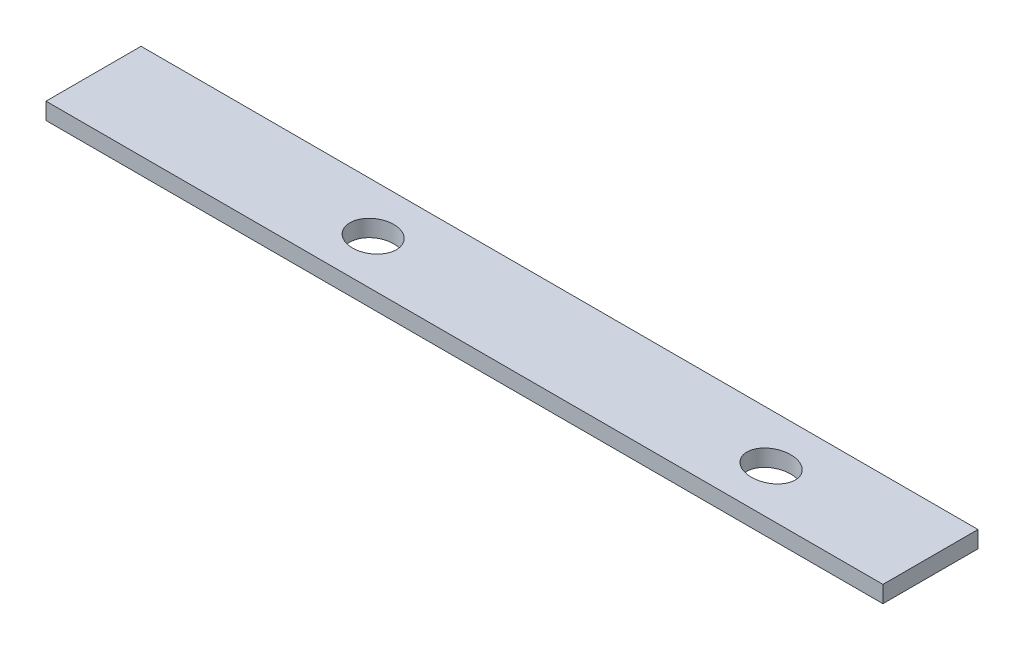
ISO-10303-21;
HEADER;
FILE_DESCRIPTION(('STEP AP214'),'2;1');
FILE_NAME('part.step','',(''),(''),'','','');
FILE_SCHEMA(('AUTOMOTIVE_DESIGN { 1 0 10303 214 1 1 1 1 }'));
ENDSEC;
DATA;
#1=APPLICATION_CONTEXT('core data for automotive mechanical design processes');
#2=APPLICATION_PROTOCOL_DEFINITION('international standard','automotive_design',2000,#1);
#3=PRODUCT_CONTEXT('',#1,'mechanical');
#4=PRODUCT('Part','Part','',(#3));
#5=PRODUCT_RELATED_PRODUCT_CATEGORY('part','',(#4));
#6=PRODUCT_DEFINITION_FORMATION('','',#4);
#7=PRODUCT_DEFINITION_CONTEXT('part definition',#1,'design');
#8=PRODUCT_DEFINITION('design','',#6,#7);
#9=PRODUCT_DEFINITION_SHAPE('','',#8);
#10=(LENGTH_UNIT() NAMED_UNIT(*) SI_UNIT(.MILLI.,.METRE.));
#11=(NAMED_UNIT(*) PLANE_ANGLE_UNIT() SI_UNIT($,.RADIAN.));
#12=(NAMED_UNIT(*) SI_UNIT($,.STERADIAN.) SOLID_ANGLE_UNIT());
#13=UNCERTAINTY_MEASURE_WITH_UNIT(LENGTH_MEASURE(1.E-05),#10,'distance_accuracy_value','');
#14=(GEOMETRIC_REPRESENTATION_CONTEXT(3) GLOBAL_UNCERTAINTY_ASSIGNED_CONTEXT((#13)) GLOBAL_UNIT_ASSIGNED_CONTEXT((#10,
#11,#12)) REPRESENTATION_CONTEXT('',''));
#15=CARTESIAN_POINT('',(0.,0.,0.));
#16=DIRECTION('',(0.,0.,1.));
#17=DIRECTION('',(1.,0.,0.));
#18=AXIS2_PLACEMENT_3D('',#15,#16,#17);
#19=CARTESIAN_POINT('',(-25.4357798165138,0.9,0.));
#20=DIRECTION('',(1.,0.,0.));
#21=DIRECTION('',(0.,0.,-1.));
#22=AXIS2_PLACEMENT_3D('',#19,#20,#21);
#23=PLANE('',#22);
#24=DIRECTION('',(0.,0.,1.));
#25=VECTOR('',#24,1.);
#26=CARTESIAN_POINT('',(-25.4357798165138,0.,0.));
#27=LINE('',#26,#25);
#28=CARTESIAN_POINT('',(-25.4357798165138,0.,0.));
#29=VERTEX_POINT('',#28);
#30=CARTESIAN_POINT('',(-25.4357798165138,0.,5.1));
#31=VERTEX_POINT('',#30);
#32=EDGE_CURVE('E99',#29,#31,#27,.T.);
#33=ORIENTED_EDGE('',*,*,#32,.T.);
#34=DIRECTION('',(0.,-1.,0.));
#35=VECTOR('',#34,1.);
#36=CARTESIAN_POINT('',(-25.4357798165138,0.9,5.1));
#37=LINE('',#36,#35);
#38=CARTESIAN_POINT('',(-25.4357798165138,0.9,5.1));
#39=VERTEX_POINT('',#38);
#40=EDGE_CURVE('E11',#39,#31,#37,.T.);
#41=ORIENTED_EDGE('',*,*,#40,.F.);
#42=DIRECTION('',(0.,0.,1.));
#43=VECTOR('',#42,1.);
#44=CARTESIAN_POINT('',(-25.4357798165138,0.9,0.));
#45=LINE('',#44,#43);
#46=CARTESIAN_POINT('',(-25.4357798165138,0.9,0.));
#47=VERTEX_POINT('',#46);
#48=EDGE_CURVE('E87',#47,#39,#45,.T.);
#49=ORIENTED_EDGE('',*,*,#48,.F.);
#50=DIRECTION('',(0.,-1.,0.));
#51=VECTOR('',#50,1.);
#52=CARTESIAN_POINT('',(-25.4357798165138,0.9,0.));
#53=LINE('',#52,#51);
#54=EDGE_CURVE('E95',#47,#29,#53,.T.);
#55=ORIENTED_EDGE('',*,*,#54,.T.);
#56=EDGE_LOOP('',(#33,#41,#49,#55));
#57=FACE_BOUND('',#56,.T.);
#58=ADVANCED_FACE('F36',(#57),#23,.F.);
#59=CARTESIAN_POINT('',(-25.4357798165138,0.9,5.1));
#60=DIRECTION('',(0.,0.,-1.));
#61=DIRECTION('',(-1.,0.,0.));
#62=AXIS2_PLACEMENT_3D('',#59,#60,#61);
#63=PLANE('',#62);
#64=DIRECTION('',(1.,0.,0.));
#65=VECTOR('',#64,1.);
#66=CARTESIAN_POINT('',(-25.4357798165138,0.,5.1));
#67=LINE('',#66,#65);
#68=CARTESIAN_POINT('',(19.4642201834862,0.,5.1));
#69=VERTEX_POINT('',#68);
#70=EDGE_CURVE('E91',#31,#69,#67,.T.);
#71=ORIENTED_EDGE('',*,*,#70,.T.);
#72=DIRECTION('',(0.,-1.,0.));
#73=VECTOR('',#72,1.);
#74=CARTESIAN_POINT('',(19.4642201834862,0.9,5.1));
#75=LINE('',#74,#73);
#76=CARTESIAN_POINT('',(19.4642201834862,0.9,5.1));
#77=VERTEX_POINT('',#76);
#78=EDGE_CURVE('E44',#77,#69,#75,.T.);
#79=ORIENTED_EDGE('',*,*,#78,.F.);
#80=DIRECTION('',(1.,0.,0.));
#81=VECTOR('',#80,1.);
#82=CARTESIAN_POINT('',(-25.4357798165138,0.9,5.1));
#83=LINE('',#82,#81);
#84=EDGE_CURVE('E82',#39,#77,#83,.T.);
#85=ORIENTED_EDGE('',*,*,#84,.F.);
#86=ORIENTED_EDGE('',*,*,#40,.T.);
#87=EDGE_LOOP('',(#71,#79,#85,#86));
#88=FACE_BOUND('',#87,.T.);
#89=ADVANCED_FACE('F90',(#88),#63,.F.);
#90=CARTESIAN_POINT('',(19.4642201834862,0.9,0.));
#91=DIRECTION('',(-1.,0.,0.));
#92=DIRECTION('',(0.,0.,1.));
#93=AXIS2_PLACEMENT_3D('',#90,#91,#92);
#94=PLANE('',#93);
#95=DIRECTION('',(0.,0.,-1.));
#96=VECTOR('',#95,1.);
#97=CARTESIAN_POINT('',(19.4642201834862,0.,0.));
#98=LINE('',#97,#96);
#99=CARTESIAN_POINT('',(19.4642201834862,0.,0.));
#100=VERTEX_POINT('',#99);
#101=EDGE_CURVE('E69',#69,#100,#98,.T.);
#102=ORIENTED_EDGE('',*,*,#101,.T.);
#103=DIRECTION('',(0.,-1.,0.));
#104=VECTOR('',#103,1.);
#105=CARTESIAN_POINT('',(19.4642201834862,0.9,0.));
#106=LINE('',#105,#104);
#107=CARTESIAN_POINT('',(19.4642201834862,0.9,0.));
#108=VERTEX_POINT('',#107);
#109=EDGE_CURVE('E92',#108,#100,#106,.T.);
#110=ORIENTED_EDGE('',*,*,#109,.F.);
#111=DIRECTION('',(0.,0.,-1.));
#112=VECTOR('',#111,1.);
#113=CARTESIAN_POINT('',(19.4642201834862,0.9,0.));
#114=LINE('',#113,#112);
#115=EDGE_CURVE('E85',#77,#108,#114,.T.);
#116=ORIENTED_EDGE('',*,*,#115,.F.);
#117=ORIENTED_EDGE('',*,*,#78,.T.);
#118=EDGE_LOOP('',(#102,#110,#116,#117));
#119=FACE_BOUND('',#118,.T.);
#120=ADVANCED_FACE('F93',(#119),#94,.F.);
#121=CARTESIAN_POINT('',(-25.4357798165138,0.9,0.));
#122=DIRECTION('',(0.,0.,1.));
#123=DIRECTION('',(1.,0.,0.));
#124=AXIS2_PLACEMENT_3D('',#121,#122,#123);
#125=PLANE('',#124);
#126=DIRECTION('',(-1.,0.,0.));
#127=VECTOR('',#126,1.);
#128=CARTESIAN_POINT('',(-25.4357798165138,0.,0.));
#129=LINE('',#128,#127);
#130=EDGE_CURVE('E75',#100,#29,#129,.T.);
#131=ORIENTED_EDGE('',*,*,#130,.T.);
#132=ORIENTED_EDGE('',*,*,#54,.F.);
#133=DIRECTION('',(-1.,0.,0.));
#134=VECTOR('',#133,1.);
#135=CARTESIAN_POINT('',(-25.4357798165138,0.9,0.));
#136=LINE('',#135,#134);
#137=EDGE_CURVE('E52',#108,#47,#136,.T.);
#138=ORIENTED_EDGE('',*,*,#137,.F.);
#139=ORIENTED_EDGE('',*,*,#109,.T.);
#140=EDGE_LOOP('',(#131,#132,#138,#139));
#141=FACE_BOUND('',#140,.T.);
#142=ADVANCED_FACE('F107',(#141),#125,.F.);
#143=CARTESIAN_POINT('',(0.,0.9,0.));
#144=DIRECTION('',(0.,1.,0.));
#145=DIRECTION('',(0.,0.,1.));
#146=AXIS2_PLACEMENT_3D('',#143,#144,#145);
#147=PLANE('',#146);
#148=CARTESIAN_POINT('',(10.9642201834862,0.9,2.6));
#149=DIRECTION('',(0.,1.,0.));
#150=DIRECTION('',(1.,0.,0.));
#151=AXIS2_PLACEMENT_3D('',#148,#149,#150);
#152=ELLIPSE('',#151,1.3,1.05);
#153=CARTESIAN_POINT('',(12.2642201834862,0.9,2.6));
#154=VERTEX_POINT('',#153);
#155=EDGE_CURVE('E209',#154,#154,#152,.T.);
#156=ORIENTED_EDGE('',*,*,#155,.F.);
#157=EDGE_LOOP('',(#156));
#158=FACE_BOUND('',#157,.T.);
#159=CARTESIAN_POINT('',(-10.3857798165138,0.9,2.6));
#160=DIRECTION('',(0.,1.,0.));
#161=DIRECTION('',(1.,0.,0.));
#162=AXIS2_PLACEMENT_3D('',#159,#160,#161);
#163=ELLIPSE('',#162,1.25,1.1);
#164=CARTESIAN_POINT('',(-9.13577981651377,0.9,2.6));
#165=VERTEX_POINT('',#164);
#166=EDGE_CURVE('E117',#165,#165,#163,.T.);
#167=ORIENTED_EDGE('',*,*,#166,.F.);
#168=EDGE_LOOP('',(#167));
#169=FACE_BOUND('',#168,.T.);
#170=ORIENTED_EDGE('',*,*,#48,.T.);
#171=ORIENTED_EDGE('',*,*,#84,.T.);
#172=ORIENTED_EDGE('',*,*,#115,.T.);
#173=ORIENTED_EDGE('',*,*,#137,.T.);
#174=EDGE_LOOP('',(#170,#171,#172,#173));
#175=FACE_BOUND('',#174,.T.);
#176=ADVANCED_FACE('F83',(#158,#169,#175),#147,.T.);
#177=CARTESIAN_POINT('',(0.,0.,0.));
#178=DIRECTION('',(0.,1.,0.));
#179=DIRECTION('',(0.,0.,1.));
#180=AXIS2_PLACEMENT_3D('',#177,#178,#179);
#181=PLANE('',#180);
#182=CARTESIAN_POINT('',(10.9642201834862,0.,2.6));
#183=DIRECTION('',(0.,1.,0.));
#184=DIRECTION('',(1.,0.,0.));
#185=AXIS2_PLACEMENT_3D('',#182,#183,#184);
#186=ELLIPSE('',#185,1.3,1.05);
#187=CARTESIAN_POINT('',(12.2642201834862,0.,2.6));
#188=VERTEX_POINT('',#187);
#189=EDGE_CURVE('E102',#188,#188,#186,.T.);
#190=ORIENTED_EDGE('',*,*,#189,.T.);
#191=EDGE_LOOP('',(#190));
#192=FACE_BOUND('',#191,.T.);
#193=CARTESIAN_POINT('',(-10.3857798165138,0.,2.6));
#194=DIRECTION('',(0.,1.,0.));
#195=DIRECTION('',(1.,0.,0.));
#196=AXIS2_PLACEMENT_3D('',#193,#194,#195);
#197=ELLIPSE('',#196,1.25,1.1);
#198=CARTESIAN_POINT('',(-9.13577981651377,0.,2.6));
#199=VERTEX_POINT('',#198);
#200=EDGE_CURVE('E113',#199,#199,#197,.T.);
#201=ORIENTED_EDGE('',*,*,#200,.T.);
#202=EDGE_LOOP('',(#201));
#203=FACE_BOUND('',#202,.T.);
#204=ORIENTED_EDGE('',*,*,#32,.F.);
#205=ORIENTED_EDGE('',*,*,#130,.F.);
#206=ORIENTED_EDGE('',*,*,#101,.F.);
#207=ORIENTED_EDGE('',*,*,#70,.F.);
#208=EDGE_LOOP('',(#204,#205,#206,#207));
#209=FACE_BOUND('',#208,.T.);
#210=ADVANCED_FACE('F110',(#192,#203,#209),#181,.F.);
#211=DIRECTION('',(0.,1.,0.));
#212=VECTOR('',#211,1.);
#213=SURFACE_OF_LINEAR_EXTRUSION('',#197,#212);
#214=ORIENTED_EDGE('',*,*,#200,.F.);
#215=EDGE_LOOP('',(#214));
#216=FACE_BOUND('',#215,.T.);
#217=ORIENTED_EDGE('',*,*,#166,.T.);
#218=EDGE_LOOP('',(#217));
#219=FACE_BOUND('',#218,.T.);
#220=ADVANCED_FACE('F120',(#216,#219),#213,.F.);
#221=DIRECTION('',(0.,1.,0.));
#222=VECTOR('',#221,1.);
#223=SURFACE_OF_LINEAR_EXTRUSION('',#186,#222);
#224=ORIENTED_EDGE('',*,*,#189,.F.);
#225=EDGE_LOOP('',(#224));
#226=FACE_BOUND('',#225,.T.);
#227=ORIENTED_EDGE('',*,*,#155,.T.);
#228=EDGE_LOOP('',(#227));
#229=FACE_BOUND('',#228,.T.);
#230=ADVANCED_FACE('F124',(#226,#229),#223,.F.);
#231=CLOSED_SHELL('',(#58,#89,#120,#142,#176,#210,#220,#230));
#232=MANIFOLD_SOLID_BREP('B2',#231);
#233=ADVANCED_BREP_SHAPE_REPRESENTATION('',(#18,#232),#14);
#234=SHAPE_DEFINITION_REPRESENTATION(#9,#233);
ENDSEC;
END-ISO-10303-21;
